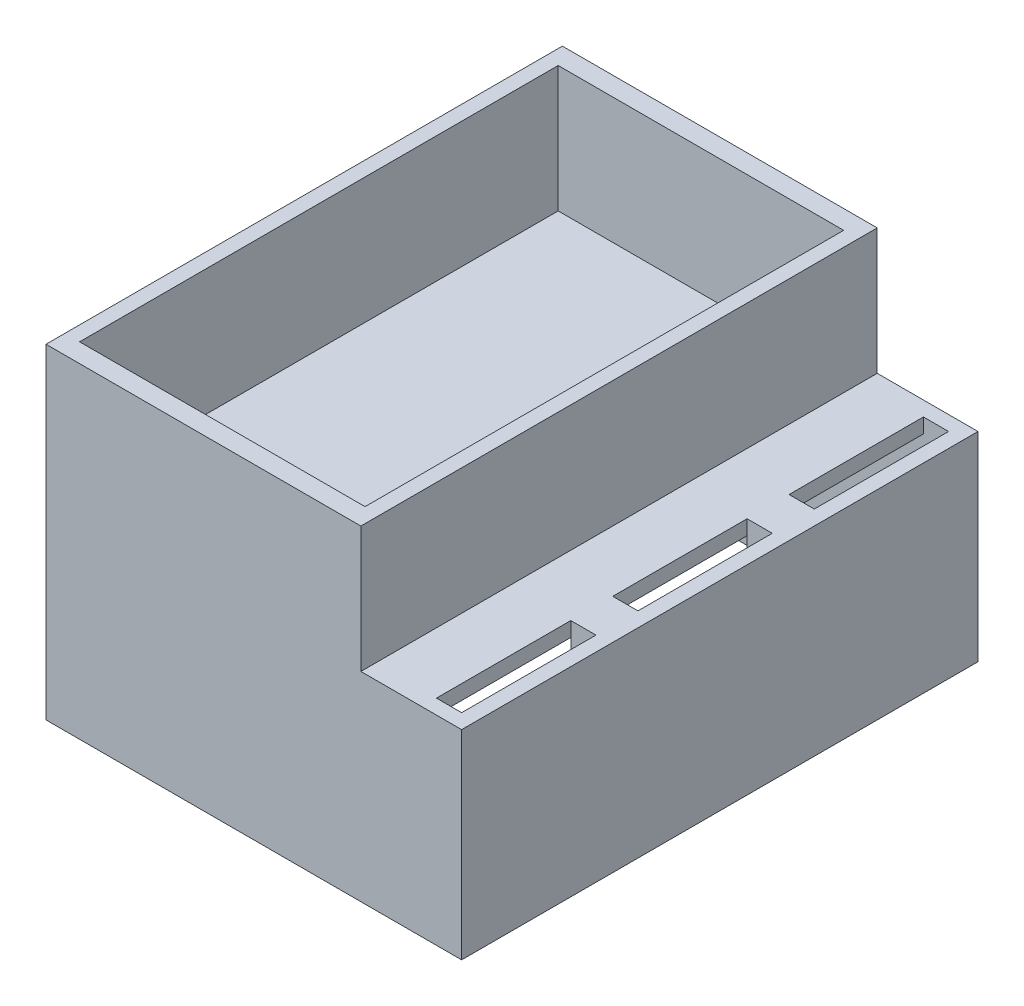
ISO-10303-21;
HEADER;
FILE_DESCRIPTION(('STEP AP214'),'2;1');
FILE_NAME('part.step','',(''),(''),'','','');
FILE_SCHEMA(('AUTOMOTIVE_DESIGN { 1 0 10303 214 1 1 1 1 }'));
ENDSEC;
DATA;
#1=APPLICATION_CONTEXT('core data for automotive mechanical design processes');
#2=APPLICATION_PROTOCOL_DEFINITION('international standard','automotive_design',2000,#1);
#3=PRODUCT_CONTEXT('',#1,'mechanical');
#4=PRODUCT('Part','Part','',(#3));
#5=PRODUCT_RELATED_PRODUCT_CATEGORY('part','',(#4));
#6=PRODUCT_DEFINITION_FORMATION('','',#4);
#7=PRODUCT_DEFINITION_CONTEXT('part definition',#1,'design');
#8=PRODUCT_DEFINITION('design','',#6,#7);
#9=PRODUCT_DEFINITION_SHAPE('','',#8);
#10=(LENGTH_UNIT() NAMED_UNIT(*) SI_UNIT(.MILLI.,.METRE.));
#11=(NAMED_UNIT(*) PLANE_ANGLE_UNIT() SI_UNIT($,.RADIAN.));
#12=(NAMED_UNIT(*) SI_UNIT($,.STERADIAN.) SOLID_ANGLE_UNIT());
#13=UNCERTAINTY_MEASURE_WITH_UNIT(LENGTH_MEASURE(1.E-05),#10,'distance_accuracy_value','');
#14=(GEOMETRIC_REPRESENTATION_CONTEXT(3) GLOBAL_UNCERTAINTY_ASSIGNED_CONTEXT((#13)) GLOBAL_UNIT_ASSIGNED_CONTEXT((#10,
#11,#12)) REPRESENTATION_CONTEXT('',''));
#15=CARTESIAN_POINT('',(0.,0.,0.));
#16=DIRECTION('',(0.,0.,1.));
#17=DIRECTION('',(1.,0.,0.));
#18=AXIS2_PLACEMENT_3D('',#15,#16,#17);
#19=CARTESIAN_POINT('',(0.,23.75,0.));
#20=DIRECTION('',(0.,-1.,0.));
#21=DIRECTION('',(0.,0.,-1.));
#22=AXIS2_PLACEMENT_3D('',#19,#20,#21);
#23=PLANE('',#22);
#24=DIRECTION('',(-1.,0.,0.));
#25=VECTOR('',#24,1.);
#26=CARTESIAN_POINT('',(0.,23.75,58.3912007269676));
#27=LINE('',#26,#25);
#28=CARTESIAN_POINT('',(-90.4120249125021,23.75,58.3912007269676));
#29=VERTEX_POINT('',#28);
#30=CARTESIAN_POINT('',(-93.4120249125021,23.75,58.3912007269676));
#31=VERTEX_POINT('',#30);
#32=EDGE_CURVE('E298',#29,#31,#27,.T.);
#33=ORIENTED_EDGE('',*,*,#32,.F.);
#34=DIRECTION('',(0.,0.,1.));
#35=VECTOR('',#34,1.);
#36=CARTESIAN_POINT('',(-90.4120249125021,23.75,0.));
#37=LINE('',#36,#35);
#38=CARTESIAN_POINT('',(-90.4120249125021,23.75,74.3912007269676));
#39=VERTEX_POINT('',#38);
#40=EDGE_CURVE('E300',#29,#39,#37,.T.);
#41=ORIENTED_EDGE('',*,*,#40,.T.);
#42=DIRECTION('',(-1.,0.,0.));
#43=VECTOR('',#42,1.);
#44=CARTESIAN_POINT('',(0.,23.75,74.3912007269676));
#45=LINE('',#44,#43);
#46=CARTESIAN_POINT('',(-93.4120249125021,23.75,74.3912007269676));
#47=VERTEX_POINT('',#46);
#48=EDGE_CURVE('E304',#39,#47,#45,.T.);
#49=ORIENTED_EDGE('',*,*,#48,.T.);
#50=DIRECTION('',(0.,0.,-1.));
#51=VECTOR('',#50,1.);
#52=CARTESIAN_POINT('',(-93.4120249125021,23.75,0.));
#53=LINE('',#52,#51);
#54=EDGE_CURVE('E307',#47,#31,#53,.T.);
#55=ORIENTED_EDGE('',*,*,#54,.T.);
#56=EDGE_LOOP('',(#33,#41,#49,#55));
#57=FACE_BOUND('',#56,.T.);
#58=DIRECTION('',(1.,0.,0.));
#59=VECTOR('',#58,1.);
#60=CARTESIAN_POINT('',(0.,23.75,16.3912007269676));
#61=LINE('',#60,#59);
#62=CARTESIAN_POINT('',(-93.4120249125021,23.75,16.3912007269676));
#63=VERTEX_POINT('',#62);
#64=CARTESIAN_POINT('',(-90.4120249125021,23.75,16.3912007269676));
#65=VERTEX_POINT('',#64);
#66=EDGE_CURVE('E330',#63,#65,#61,.T.);
#67=ORIENTED_EDGE('',*,*,#66,.T.);
#68=DIRECTION('',(0.,0.,1.));
#69=VECTOR('',#68,1.);
#70=CARTESIAN_POINT('',(-90.4120249125021,23.75,0.));
#71=LINE('',#70,#69);
#72=CARTESIAN_POINT('',(-90.4120249125021,23.75,32.3912007269676));
#73=VERTEX_POINT('',#72);
#74=EDGE_CURVE('E320',#65,#73,#71,.T.);
#75=ORIENTED_EDGE('',*,*,#74,.T.);
#76=DIRECTION('',(-1.,0.,0.));
#77=VECTOR('',#76,1.);
#78=CARTESIAN_POINT('',(0.,23.75,32.3912007269676));
#79=LINE('',#78,#77);
#80=CARTESIAN_POINT('',(-93.4120249125021,23.75,32.3912007269676));
#81=VERTEX_POINT('',#80);
#82=EDGE_CURVE('E323',#73,#81,#79,.T.);
#83=ORIENTED_EDGE('',*,*,#82,.T.);
#84=DIRECTION('',(0.,0.,-1.));
#85=VECTOR('',#84,1.);
#86=CARTESIAN_POINT('',(-93.4120249125021,23.75,0.));
#87=LINE('',#86,#85);
#88=EDGE_CURVE('E327',#81,#63,#87,.T.);
#89=ORIENTED_EDGE('',*,*,#88,.T.);
#90=EDGE_LOOP('',(#67,#75,#83,#89));
#91=FACE_BOUND('',#90,.T.);
#92=DIRECTION('',(-1.,0.,0.));
#93=VECTOR('',#92,1.);
#94=CARTESIAN_POINT('',(0.,23.75,37.3912007269676));
#95=LINE('',#94,#93);
#96=CARTESIAN_POINT('',(-90.4120249125021,23.75,37.3912007269676));
#97=VERTEX_POINT('',#96);
#98=CARTESIAN_POINT('',(-93.4120249125021,23.75,37.3912007269676));
#99=VERTEX_POINT('',#98);
#100=EDGE_CURVE('E342',#97,#99,#95,.T.);
#101=ORIENTED_EDGE('',*,*,#100,.F.);
#102=DIRECTION('',(0.,0.,1.));
#103=VECTOR('',#102,1.);
#104=CARTESIAN_POINT('',(-90.4120249125021,23.75,0.));
#105=LINE('',#104,#103);
#106=CARTESIAN_POINT('',(-90.4120249125021,23.75,53.3912007269676));
#107=VERTEX_POINT('',#106);
#108=EDGE_CURVE('E344',#97,#107,#105,.T.);
#109=ORIENTED_EDGE('',*,*,#108,.T.);
#110=DIRECTION('',(-1.,0.,0.));
#111=VECTOR('',#110,1.);
#112=CARTESIAN_POINT('',(0.,23.75,53.3912007269676));
#113=LINE('',#112,#111);
#114=CARTESIAN_POINT('',(-93.4120249125021,23.75,53.3912007269676));
#115=VERTEX_POINT('',#114);
#116=EDGE_CURVE('E347',#107,#115,#113,.T.);
#117=ORIENTED_EDGE('',*,*,#116,.T.);
#118=DIRECTION('',(0.,0.,-1.));
#119=VECTOR('',#118,1.);
#120=CARTESIAN_POINT('',(-93.4120249125021,23.75,0.));
#121=LINE('',#120,#119);
#122=EDGE_CURVE('E350',#115,#99,#121,.T.);
#123=ORIENTED_EDGE('',*,*,#122,.T.);
#124=EDGE_LOOP('',(#101,#109,#117,#123));
#125=FACE_BOUND('',#124,.T.);
#126=DIRECTION('',(0.,0.,-1.));
#127=VECTOR('',#126,1.);
#128=CARTESIAN_POINT('',(-100.662024912502,23.75,14.6412007269676));
#129=LINE('',#128,#127);
#130=CARTESIAN_POINT('',(-100.662024912502,23.75,76.1412007269676));
#131=VERTEX_POINT('',#130);
#132=CARTESIAN_POINT('',(-100.662024912502,23.75,14.6412007269676));
#133=VERTEX_POINT('',#132);
#134=EDGE_CURVE('E56',#131,#133,#129,.T.);
#135=ORIENTED_EDGE('',*,*,#134,.F.);
#136=DIRECTION('',(1.,0.,0.));
#137=VECTOR('',#136,1.);
#138=CARTESIAN_POINT('',(-138.162024912502,23.75,76.1412007269676));
#139=LINE('',#138,#137);
#140=CARTESIAN_POINT('',(-88.6620249125021,23.75,76.1412007269676));
#141=VERTEX_POINT('',#140);
#142=EDGE_CURVE('E391',#131,#141,#139,.T.);
#143=ORIENTED_EDGE('',*,*,#142,.T.);
#144=DIRECTION('',(0.,0.,-1.));
#145=VECTOR('',#144,1.);
#146=CARTESIAN_POINT('',(-88.6620249125021,23.75,76.1412007269676));
#147=LINE('',#146,#145);
#148=CARTESIAN_POINT('',(-88.6620249125021,23.75,14.6412007269676));
#149=VERTEX_POINT('',#148);
#150=EDGE_CURVE('E393',#141,#149,#147,.T.);
#151=ORIENTED_EDGE('',*,*,#150,.T.);
#152=DIRECTION('',(-1.,0.,0.));
#153=VECTOR('',#152,1.);
#154=CARTESIAN_POINT('',(-138.162024912502,23.75,14.6412007269676));
#155=LINE('',#154,#153);
#156=EDGE_CURVE('E396',#149,#133,#155,.T.);
#157=ORIENTED_EDGE('',*,*,#156,.T.);
#158=EDGE_LOOP('',(#135,#143,#151,#157));
#159=FACE_BOUND('',#158,.T.);
#160=ADVANCED_FACE('F33',(#57,#91,#125,#159),#23,.F.);
#161=CARTESIAN_POINT('',(0.,22.,0.));
#162=DIRECTION('',(0.,1.,0.));
#163=DIRECTION('',(0.,0.,1.));
#164=AXIS2_PLACEMENT_3D('',#161,#162,#163);
#165=PLANE('',#164);
#166=DIRECTION('',(0.,0.,-1.));
#167=VECTOR('',#166,1.);
#168=CARTESIAN_POINT('',(-93.4120249125021,22.,37.3912007269676));
#169=LINE('',#168,#167);
#170=CARTESIAN_POINT('',(-93.4120249125021,22.,37.3912007269676));
#171=VERTEX_POINT('',#170);
#172=CARTESIAN_POINT('',(-93.4120249125021,22.,32.3912007269676));
#173=VERTEX_POINT('',#172);
#174=EDGE_CURVE('E267',#171,#173,#169,.T.);
#175=ORIENTED_EDGE('',*,*,#174,.F.);
#176=DIRECTION('',(0.,0.,-1.));
#177=VECTOR('',#176,1.);
#178=CARTESIAN_POINT('',(-93.4120249125021,22.,0.));
#179=LINE('',#178,#177);
#180=CARTESIAN_POINT('',(-93.4120249125021,22.,53.3912007269676));
#181=VERTEX_POINT('',#180);
#182=EDGE_CURVE('E295',#181,#171,#179,.T.);
#183=ORIENTED_EDGE('',*,*,#182,.F.);
#184=DIRECTION('',(0.,0.,-1.));
#185=VECTOR('',#184,1.);
#186=CARTESIAN_POINT('',(-93.4120249125021,22.,58.3912007269676));
#187=LINE('',#186,#185);
#188=CARTESIAN_POINT('',(-93.4120249125021,22.,58.3912007269676));
#189=VERTEX_POINT('',#188);
#190=EDGE_CURVE('E269',#189,#181,#187,.T.);
#191=ORIENTED_EDGE('',*,*,#190,.F.);
#192=DIRECTION('',(0.,0.,-1.));
#193=VECTOR('',#192,1.);
#194=CARTESIAN_POINT('',(-93.4120249125021,22.,0.));
#195=LINE('',#194,#193);
#196=CARTESIAN_POINT('',(-93.4120249125021,22.,74.3912007269676));
#197=VERTEX_POINT('',#196);
#198=EDGE_CURVE('E301',#197,#189,#195,.T.);
#199=ORIENTED_EDGE('',*,*,#198,.F.);
#200=DIRECTION('',(-1.,0.,0.));
#201=VECTOR('',#200,1.);
#202=CARTESIAN_POINT('',(-90.4120249125021,22.,74.3912007269676));
#203=LINE('',#202,#201);
#204=CARTESIAN_POINT('',(-136.412024912502,22.,74.3912007269676));
#205=VERTEX_POINT('',#204);
#206=EDGE_CURVE('E363',#197,#205,#203,.T.);
#207=ORIENTED_EDGE('',*,*,#206,.T.);
#208=DIRECTION('',(0.,0.,-1.));
#209=VECTOR('',#208,1.);
#210=CARTESIAN_POINT('',(-136.412024912502,22.,74.3912007269676));
#211=LINE('',#210,#209);
#212=CARTESIAN_POINT('',(-136.412024912502,22.,16.3912007269676));
#213=VERTEX_POINT('',#212);
#214=EDGE_CURVE('E365',#205,#213,#211,.T.);
#215=ORIENTED_EDGE('',*,*,#214,.T.);
#216=DIRECTION('',(1.,0.,0.));
#217=VECTOR('',#216,1.);
#218=CARTESIAN_POINT('',(-90.4120249125021,22.,16.3912007269676));
#219=LINE('',#218,#217);
#220=CARTESIAN_POINT('',(-93.4120249125021,22.,16.3912007269676));
#221=VERTEX_POINT('',#220);
#222=EDGE_CURVE('E369',#213,#221,#219,.T.);
#223=ORIENTED_EDGE('',*,*,#222,.T.);
#224=DIRECTION('',(0.,0.,-1.));
#225=VECTOR('',#224,1.);
#226=CARTESIAN_POINT('',(-93.4120249125021,22.,0.));
#227=LINE('',#226,#225);
#228=EDGE_CURVE('E324',#173,#221,#227,.T.);
#229=ORIENTED_EDGE('',*,*,#228,.F.);
#230=EDGE_LOOP('',(#175,#183,#191,#199,#207,#215,#223,#229));
#231=FACE_BOUND('',#230,.T.);
#232=ADVANCED_FACE('F438',(#231),#165,.F.);
#233=CARTESIAN_POINT('',(-138.162024912502,23.75,76.1412007269676));
#234=DIRECTION('',(1.,0.,0.));
#235=DIRECTION('',(0.,0.,-1.));
#236=AXIS2_PLACEMENT_3D('',#233,#234,#235);
#237=PLANE('',#236);
#238=DIRECTION('',(0.,0.,1.));
#239=VECTOR('',#238,1.);
#240=CARTESIAN_POINT('',(-138.162024912502,0.,76.1412007269676));
#241=LINE('',#240,#239);
#242=CARTESIAN_POINT('',(-138.162024912502,0.,14.6412007269676));
#243=VERTEX_POINT('',#242);
#244=CARTESIAN_POINT('',(-138.162024912502,0.,76.1412007269676));
#245=VERTEX_POINT('',#244);
#246=EDGE_CURVE('E384',#243,#245,#241,.T.);
#247=ORIENTED_EDGE('',*,*,#246,.T.);
#248=DIRECTION('',(0.,-1.,0.));
#249=VECTOR('',#248,1.);
#250=CARTESIAN_POINT('',(-138.162024912502,23.75,76.1412007269676));
#251=LINE('',#250,#249);
#252=CARTESIAN_POINT('',(-138.162024912502,38.75,76.1412007269676));
#253=VERTEX_POINT('',#252);
#254=EDGE_CURVE('E11',#253,#245,#251,.T.);
#255=ORIENTED_EDGE('',*,*,#254,.F.);
#256=DIRECTION('',(0.,0.,1.));
#257=VECTOR('',#256,1.);
#258=CARTESIAN_POINT('',(-138.162024912502,38.75,14.6412007269676));
#259=LINE('',#258,#257);
#260=CARTESIAN_POINT('',(-138.162024912502,38.75,14.6412007269676));
#261=VERTEX_POINT('',#260);
#262=EDGE_CURVE('E244',#261,#253,#259,.T.);
#263=ORIENTED_EDGE('',*,*,#262,.F.);
#264=DIRECTION('',(0.,-1.,0.));
#265=VECTOR('',#264,1.);
#266=CARTESIAN_POINT('',(-138.162024912502,23.75,14.6412007269676));
#267=LINE('',#266,#265);
#268=EDGE_CURVE('E398',#261,#243,#267,.T.);
#269=ORIENTED_EDGE('',*,*,#268,.T.);
#270=EDGE_LOOP('',(#247,#255,#263,#269));
#271=FACE_BOUND('',#270,.T.);
#272=ADVANCED_FACE('F35',(#271),#237,.F.);
#273=CARTESIAN_POINT('',(-138.162024912502,23.75,76.1412007269676));
#274=DIRECTION('',(0.,0.,-1.));
#275=DIRECTION('',(-1.,0.,0.));
#276=AXIS2_PLACEMENT_3D('',#273,#274,#275);
#277=PLANE('',#276);
#278=DIRECTION('',(1.,0.,0.));
#279=VECTOR('',#278,1.);
#280=CARTESIAN_POINT('',(-138.162024912502,0.,76.1412007269676));
#281=LINE('',#280,#279);
#282=CARTESIAN_POINT('',(-88.6620249125021,0.,76.1412007269676));
#283=VERTEX_POINT('',#282);
#284=EDGE_CURVE('E401',#245,#283,#281,.T.);
#285=ORIENTED_EDGE('',*,*,#284,.T.);
#286=DIRECTION('',(0.,-1.,0.));
#287=VECTOR('',#286,1.);
#288=CARTESIAN_POINT('',(-88.6620249125021,23.75,76.1412007269676));
#289=LINE('',#288,#287);
#290=EDGE_CURVE('E41',#141,#283,#289,.T.);
#291=ORIENTED_EDGE('',*,*,#290,.F.);
#292=ORIENTED_EDGE('',*,*,#142,.F.);
#293=DIRECTION('',(0.,-1.,0.));
#294=VECTOR('',#293,1.);
#295=CARTESIAN_POINT('',(-100.662024912502,38.75,76.1412007269676));
#296=LINE('',#295,#294);
#297=CARTESIAN_POINT('',(-100.662024912502,38.75,76.1412007269676));
#298=VERTEX_POINT('',#297);
#299=EDGE_CURVE('E258',#298,#131,#296,.T.);
#300=ORIENTED_EDGE('',*,*,#299,.F.);
#301=DIRECTION('',(1.,0.,0.));
#302=VECTOR('',#301,1.);
#303=CARTESIAN_POINT('',(-138.162024912502,38.75,76.1412007269676));
#304=LINE('',#303,#302);
#305=EDGE_CURVE('E247',#253,#298,#304,.T.);
#306=ORIENTED_EDGE('',*,*,#305,.F.);
#307=ORIENTED_EDGE('',*,*,#254,.T.);
#308=EDGE_LOOP('',(#285,#291,#292,#300,#306,#307));
#309=FACE_BOUND('',#308,.T.);
#310=ADVANCED_FACE('F436',(#309),#277,.F.);
#311=CARTESIAN_POINT('',(-88.6620249125021,23.75,76.1412007269676));
#312=DIRECTION('',(-1.,0.,0.));
#313=DIRECTION('',(0.,0.,1.));
#314=AXIS2_PLACEMENT_3D('',#311,#312,#313);
#315=PLANE('',#314);
#316=DIRECTION('',(0.,0.,-1.));
#317=VECTOR('',#316,1.);
#318=CARTESIAN_POINT('',(-88.6620249125021,0.,76.1412007269676));
#319=LINE('',#318,#317);
#320=CARTESIAN_POINT('',(-88.6620249125021,0.,14.6412007269676));
#321=VERTEX_POINT('',#320);
#322=EDGE_CURVE('E403',#283,#321,#319,.T.);
#323=ORIENTED_EDGE('',*,*,#322,.T.);
#324=DIRECTION('',(0.,-1.,0.));
#325=VECTOR('',#324,1.);
#326=CARTESIAN_POINT('',(-88.6620249125021,23.75,14.6412007269676));
#327=LINE('',#326,#325);
#328=EDGE_CURVE('E408',#149,#321,#327,.T.);
#329=ORIENTED_EDGE('',*,*,#328,.F.);
#330=ORIENTED_EDGE('',*,*,#150,.F.);
#331=ORIENTED_EDGE('',*,*,#290,.T.);
#332=EDGE_LOOP('',(#323,#329,#330,#331));
#333=FACE_BOUND('',#332,.T.);
#334=ADVANCED_FACE('F415',(#333),#315,.F.);
#335=CARTESIAN_POINT('',(-138.162024912502,23.75,14.6412007269676));
#336=DIRECTION('',(0.,0.,1.));
#337=DIRECTION('',(1.,0.,0.));
#338=AXIS2_PLACEMENT_3D('',#335,#336,#337);
#339=PLANE('',#338);
#340=DIRECTION('',(-1.,0.,0.));
#341=VECTOR('',#340,1.);
#342=CARTESIAN_POINT('',(-138.162024912502,0.,14.6412007269676));
#343=LINE('',#342,#341);
#344=EDGE_CURVE('E394',#321,#243,#343,.T.);
#345=ORIENTED_EDGE('',*,*,#344,.T.);
#346=ORIENTED_EDGE('',*,*,#268,.F.);
#347=DIRECTION('',(-1.,0.,0.));
#348=VECTOR('',#347,1.);
#349=CARTESIAN_POINT('',(-138.162024912502,38.75,14.6412007269676));
#350=LINE('',#349,#348);
#351=CARTESIAN_POINT('',(-100.662024912502,38.75,14.6412007269676));
#352=VERTEX_POINT('',#351);
#353=EDGE_CURVE('E251',#352,#261,#350,.T.);
#354=ORIENTED_EDGE('',*,*,#353,.F.);
#355=DIRECTION('',(0.,-1.,0.));
#356=VECTOR('',#355,1.);
#357=CARTESIAN_POINT('',(-100.662024912502,38.75,14.6412007269676));
#358=LINE('',#357,#356);
#359=EDGE_CURVE('E254',#352,#133,#358,.T.);
#360=ORIENTED_EDGE('',*,*,#359,.T.);
#361=ORIENTED_EDGE('',*,*,#156,.F.);
#362=ORIENTED_EDGE('',*,*,#328,.T.);
#363=EDGE_LOOP('',(#345,#346,#354,#360,#361,#362));
#364=FACE_BOUND('',#363,.T.);
#365=ADVANCED_FACE('F423',(#364),#339,.F.);
#366=CARTESIAN_POINT('',(0.,0.,0.));
#367=DIRECTION('',(0.,-1.,0.));
#368=DIRECTION('',(0.,0.,-1.));
#369=AXIS2_PLACEMENT_3D('',#366,#367,#368);
#370=PLANE('',#369);
#371=DIRECTION('',(0.,0.,1.));
#372=VECTOR('',#371,1.);
#373=CARTESIAN_POINT('',(-90.4120249125021,0.,74.3912007269676));
#374=LINE('',#373,#372);
#375=CARTESIAN_POINT('',(-90.4120249125021,0.,16.3912007269676));
#376=VERTEX_POINT('',#375);
#377=CARTESIAN_POINT('',(-90.4120249125021,0.,74.3912007269676));
#378=VERTEX_POINT('',#377);
#379=EDGE_CURVE('E316',#376,#378,#374,.T.);
#380=ORIENTED_EDGE('',*,*,#379,.F.);
#381=DIRECTION('',(1.,0.,0.));
#382=VECTOR('',#381,1.);
#383=CARTESIAN_POINT('',(-90.4120249125021,0.,16.3912007269676));
#384=LINE('',#383,#382);
#385=CARTESIAN_POINT('',(-136.412024912502,0.,16.3912007269676));
#386=VERTEX_POINT('',#385);
#387=EDGE_CURVE('E366',#386,#376,#384,.T.);
#388=ORIENTED_EDGE('',*,*,#387,.F.);
#389=DIRECTION('',(0.,0.,-1.));
#390=VECTOR('',#389,1.);
#391=CARTESIAN_POINT('',(-136.412024912502,0.,74.3912007269676));
#392=LINE('',#391,#390);
#393=CARTESIAN_POINT('',(-136.412024912502,0.,74.3912007269676));
#394=VERTEX_POINT('',#393);
#395=EDGE_CURVE('E377',#394,#386,#392,.T.);
#396=ORIENTED_EDGE('',*,*,#395,.F.);
#397=DIRECTION('',(-1.,0.,0.));
#398=VECTOR('',#397,1.);
#399=CARTESIAN_POINT('',(-90.4120249125021,0.,74.3912007269676));
#400=LINE('',#399,#398);
#401=EDGE_CURVE('E374',#378,#394,#400,.T.);
#402=ORIENTED_EDGE('',*,*,#401,.F.);
#403=EDGE_LOOP('',(#380,#388,#396,#402));
#404=FACE_BOUND('',#403,.T.);
#405=ORIENTED_EDGE('',*,*,#246,.F.);
#406=ORIENTED_EDGE('',*,*,#344,.F.);
#407=ORIENTED_EDGE('',*,*,#322,.F.);
#408=ORIENTED_EDGE('',*,*,#284,.F.);
#409=EDGE_LOOP('',(#405,#406,#407,#408));
#410=FACE_BOUND('',#409,.T.);
#411=ADVANCED_FACE('F421',(#404,#410),#370,.T.);
#412=CARTESIAN_POINT('',(-90.4120249125021,22.,74.3912007269676));
#413=DIRECTION('',(1.,0.,0.));
#414=DIRECTION('',(0.,0.,-1.));
#415=AXIS2_PLACEMENT_3D('',#412,#413,#414);
#416=PLANE('',#415);
#417=DIRECTION('',(0.,0.,-1.));
#418=VECTOR('',#417,1.);
#419=CARTESIAN_POINT('',(-90.4120249125021,18.,37.3912007269676));
#420=LINE('',#419,#418);
#421=CARTESIAN_POINT('',(-90.4120249125021,18.,37.3912007269676));
#422=VERTEX_POINT('',#421);
#423=CARTESIAN_POINT('',(-90.4120249125021,18.,32.3912007269676));
#424=VERTEX_POINT('',#423);
#425=EDGE_CURVE('E265',#422,#424,#420,.T.);
#426=ORIENTED_EDGE('',*,*,#425,.T.);
#427=DIRECTION('',(0.,-1.,0.));
#428=VECTOR('',#427,1.);
#429=CARTESIAN_POINT('',(-90.4120249125021,23.75,32.3912007269676));
#430=LINE('',#429,#428);
#431=EDGE_CURVE('E333',#73,#424,#430,.T.);
#432=ORIENTED_EDGE('',*,*,#431,.F.);
#433=ORIENTED_EDGE('',*,*,#74,.F.);
#434=DIRECTION('',(0.,-1.,0.));
#435=VECTOR('',#434,1.);
#436=CARTESIAN_POINT('',(-90.4120249125021,22.,16.3912007269676));
#437=LINE('',#436,#435);
#438=EDGE_CURVE('E382',#65,#376,#437,.T.);
#439=ORIENTED_EDGE('',*,*,#438,.T.);
#440=ORIENTED_EDGE('',*,*,#379,.T.);
#441=DIRECTION('',(0.,-1.,0.));
#442=VECTOR('',#441,1.);
#443=CARTESIAN_POINT('',(-90.4120249125021,22.,74.3912007269676));
#444=LINE('',#443,#442);
#445=EDGE_CURVE('E372',#39,#378,#444,.T.);
#446=ORIENTED_EDGE('',*,*,#445,.F.);
#447=ORIENTED_EDGE('',*,*,#40,.F.);
#448=DIRECTION('',(0.,-1.,0.));
#449=VECTOR('',#448,1.);
#450=CARTESIAN_POINT('',(-90.4120249125021,23.75,58.3912007269676));
#451=LINE('',#450,#449);
#452=CARTESIAN_POINT('',(-90.4120249125021,18.,58.3912007269676));
#453=VERTEX_POINT('',#452);
#454=EDGE_CURVE('E310',#29,#453,#451,.T.);
#455=ORIENTED_EDGE('',*,*,#454,.T.);
#456=DIRECTION('',(0.,0.,-1.));
#457=VECTOR('',#456,1.);
#458=CARTESIAN_POINT('',(-90.4120249125021,18.,58.3912007269676));
#459=LINE('',#458,#457);
#460=CARTESIAN_POINT('',(-90.4120249125021,18.,53.3912007269676));
#461=VERTEX_POINT('',#460);
#462=EDGE_CURVE('E286',#453,#461,#459,.T.);
#463=ORIENTED_EDGE('',*,*,#462,.T.);
#464=DIRECTION('',(0.,-1.,0.));
#465=VECTOR('',#464,1.);
#466=CARTESIAN_POINT('',(-90.4120249125021,23.75,53.3912007269676));
#467=LINE('',#466,#465);
#468=EDGE_CURVE('E360',#107,#461,#467,.T.);
#469=ORIENTED_EDGE('',*,*,#468,.F.);
#470=ORIENTED_EDGE('',*,*,#108,.F.);
#471=DIRECTION('',(0.,-1.,0.));
#472=VECTOR('',#471,1.);
#473=CARTESIAN_POINT('',(-90.4120249125021,23.75,37.3912007269676));
#474=LINE('',#473,#472);
#475=EDGE_CURVE('E353',#97,#422,#474,.T.);
#476=ORIENTED_EDGE('',*,*,#475,.T.);
#477=EDGE_LOOP('',(#426,#432,#433,#439,#440,#446,#447,#455,#463,#469,#470,#476));
#478=FACE_BOUND('',#477,.T.);
#479=ADVANCED_FACE('F450',(#478),#416,.F.);
#480=CARTESIAN_POINT('',(-90.4120249125021,22.,16.3912007269676));
#481=DIRECTION('',(0.,0.,-1.));
#482=DIRECTION('',(-1.,0.,0.));
#483=AXIS2_PLACEMENT_3D('',#480,#481,#482);
#484=PLANE('',#483);
#485=ORIENTED_EDGE('',*,*,#387,.T.);
#486=ORIENTED_EDGE('',*,*,#438,.F.);
#487=ORIENTED_EDGE('',*,*,#66,.F.);
#488=DIRECTION('',(0.,-1.,0.));
#489=VECTOR('',#488,1.);
#490=CARTESIAN_POINT('',(-93.4120249125021,23.75,16.3912007269676));
#491=LINE('',#490,#489);
#492=EDGE_CURVE('E312',#63,#221,#491,.T.);
#493=ORIENTED_EDGE('',*,*,#492,.T.);
#494=ORIENTED_EDGE('',*,*,#222,.F.);
#495=DIRECTION('',(0.,-1.,0.));
#496=VECTOR('',#495,1.);
#497=CARTESIAN_POINT('',(-136.412024912502,22.,16.3912007269676));
#498=LINE('',#497,#496);
#499=EDGE_CURVE('E385',#213,#386,#498,.T.);
#500=ORIENTED_EDGE('',*,*,#499,.T.);
#501=EDGE_LOOP('',(#485,#486,#487,#493,#494,#500));
#502=FACE_BOUND('',#501,.T.);
#503=ADVANCED_FACE('F484',(#502),#484,.F.);
#504=CARTESIAN_POINT('',(-136.412024912502,22.,74.3912007269676));
#505=DIRECTION('',(-1.,0.,0.));
#506=DIRECTION('',(0.,0.,1.));
#507=AXIS2_PLACEMENT_3D('',#504,#505,#506);
#508=PLANE('',#507);
#509=ORIENTED_EDGE('',*,*,#395,.T.);
#510=ORIENTED_EDGE('',*,*,#499,.F.);
#511=ORIENTED_EDGE('',*,*,#214,.F.);
#512=DIRECTION('',(0.,-1.,0.));
#513=VECTOR('',#512,1.);
#514=CARTESIAN_POINT('',(-136.412024912502,22.,74.3912007269676));
#515=LINE('',#514,#513);
#516=EDGE_CURVE('E387',#205,#394,#515,.T.);
#517=ORIENTED_EDGE('',*,*,#516,.T.);
#518=EDGE_LOOP('',(#509,#510,#511,#517));
#519=FACE_BOUND('',#518,.T.);
#520=ADVANCED_FACE('F687',(#519),#508,.F.);
#521=CARTESIAN_POINT('',(-90.4120249125021,22.,74.3912007269676));
#522=DIRECTION('',(0.,0.,1.));
#523=DIRECTION('',(1.,0.,0.));
#524=AXIS2_PLACEMENT_3D('',#521,#522,#523);
#525=PLANE('',#524);
#526=ORIENTED_EDGE('',*,*,#401,.T.);
#527=ORIENTED_EDGE('',*,*,#516,.F.);
#528=ORIENTED_EDGE('',*,*,#206,.F.);
#529=DIRECTION('',(0.,-1.,0.));
#530=VECTOR('',#529,1.);
#531=CARTESIAN_POINT('',(-93.4120249125021,23.75,74.3912007269676));
#532=LINE('',#531,#530);
#533=EDGE_CURVE('E317',#47,#197,#532,.T.);
#534=ORIENTED_EDGE('',*,*,#533,.F.);
#535=ORIENTED_EDGE('',*,*,#48,.F.);
#536=ORIENTED_EDGE('',*,*,#445,.T.);
#537=EDGE_LOOP('',(#526,#527,#528,#534,#535,#536));
#538=FACE_BOUND('',#537,.T.);
#539=ADVANCED_FACE('F497',(#538),#525,.F.);
#540=CARTESIAN_POINT('',(0.,23.75,37.3912007269676));
#541=DIRECTION('',(0.,0.,1.));
#542=DIRECTION('',(1.,0.,0.));
#543=AXIS2_PLACEMENT_3D('',#540,#541,#542);
#544=PLANE('',#543);
#545=DIRECTION('',(0.,-1.,0.));
#546=VECTOR('',#545,1.);
#547=CARTESIAN_POINT('',(-93.4120249125021,23.75,37.3912007269676));
#548=LINE('',#547,#546);
#549=EDGE_CURVE('E336',#99,#171,#548,.T.);
#550=ORIENTED_EDGE('',*,*,#549,.T.);
#551=DIRECTION('',(0.,1.,0.));
#552=VECTOR('',#551,1.);
#553=CARTESIAN_POINT('',(-93.4120249125021,18.,37.3912007269676));
#554=LINE('',#553,#552);
#555=CARTESIAN_POINT('',(-93.4120249125021,18.,37.3912007269676));
#556=VERTEX_POINT('',#555);
#557=EDGE_CURVE('E261',#556,#171,#554,.T.);
#558=ORIENTED_EDGE('',*,*,#557,.F.);
#559=DIRECTION('',(-1.,0.,0.));
#560=VECTOR('',#559,1.);
#561=CARTESIAN_POINT('',(-90.4120249125021,18.,37.3912007269676));
#562=LINE('',#561,#560);
#563=EDGE_CURVE('E273',#422,#556,#562,.T.);
#564=ORIENTED_EDGE('',*,*,#563,.F.);
#565=ORIENTED_EDGE('',*,*,#475,.F.);
#566=ORIENTED_EDGE('',*,*,#100,.T.);
#567=EDGE_LOOP('',(#550,#558,#564,#565,#566));
#568=FACE_BOUND('',#567,.T.);
#569=ADVANCED_FACE('F492',(#568),#544,.T.);
#570=CARTESIAN_POINT('',(-93.4120249125021,23.75,0.));
#571=DIRECTION('',(-1.,0.,0.));
#572=DIRECTION('',(0.,0.,1.));
#573=AXIS2_PLACEMENT_3D('',#570,#571,#572);
#574=PLANE('',#573);
#575=ORIENTED_EDGE('',*,*,#182,.T.);
#576=ORIENTED_EDGE('',*,*,#549,.F.);
#577=ORIENTED_EDGE('',*,*,#122,.F.);
#578=DIRECTION('',(0.,-1.,0.));
#579=VECTOR('',#578,1.);
#580=CARTESIAN_POINT('',(-93.4120249125021,23.75,53.3912007269676));
#581=LINE('',#580,#579);
#582=EDGE_CURVE('E358',#115,#181,#581,.T.);
#583=ORIENTED_EDGE('',*,*,#582,.T.);
#584=EDGE_LOOP('',(#575,#576,#577,#583));
#585=FACE_BOUND('',#584,.T.);
#586=ADVANCED_FACE('F496',(#585),#574,.F.);
#587=CARTESIAN_POINT('',(0.,23.75,53.3912007269676));
#588=DIRECTION('',(0.,0.,1.));
#589=DIRECTION('',(1.,0.,0.));
#590=AXIS2_PLACEMENT_3D('',#587,#588,#589);
#591=PLANE('',#590);
#592=ORIENTED_EDGE('',*,*,#468,.T.);
#593=DIRECTION('',(-1.,0.,0.));
#594=VECTOR('',#593,1.);
#595=CARTESIAN_POINT('',(-90.4120249125021,18.,53.3912007269676));
#596=LINE('',#595,#594);
#597=CARTESIAN_POINT('',(-93.4120249125021,18.,53.3912007269676));
#598=VERTEX_POINT('',#597);
#599=EDGE_CURVE('E279',#461,#598,#596,.T.);
#600=ORIENTED_EDGE('',*,*,#599,.T.);
#601=DIRECTION('',(0.,1.,0.));
#602=VECTOR('',#601,1.);
#603=CARTESIAN_POINT('',(-93.4120249125021,18.,53.3912007269676));
#604=LINE('',#603,#602);
#605=EDGE_CURVE('E289',#598,#181,#604,.T.);
#606=ORIENTED_EDGE('',*,*,#605,.T.);
#607=ORIENTED_EDGE('',*,*,#582,.F.);
#608=ORIENTED_EDGE('',*,*,#116,.F.);
#609=EDGE_LOOP('',(#592,#600,#606,#607,#608));
#610=FACE_BOUND('',#609,.T.);
#611=ADVANCED_FACE('F510',(#610),#591,.F.);
#612=CARTESIAN_POINT('',(-93.4120249125021,23.75,0.));
#613=DIRECTION('',(-1.,0.,0.));
#614=DIRECTION('',(0.,0.,1.));
#615=AXIS2_PLACEMENT_3D('',#612,#613,#614);
#616=PLANE('',#615);
#617=ORIENTED_EDGE('',*,*,#228,.T.);
#618=ORIENTED_EDGE('',*,*,#492,.F.);
#619=ORIENTED_EDGE('',*,*,#88,.F.);
#620=DIRECTION('',(0.,-1.,0.));
#621=VECTOR('',#620,1.);
#622=CARTESIAN_POINT('',(-93.4120249125021,23.75,32.3912007269676));
#623=LINE('',#622,#621);
#624=EDGE_CURVE('E338',#81,#173,#623,.T.);
#625=ORIENTED_EDGE('',*,*,#624,.T.);
#626=EDGE_LOOP('',(#617,#618,#619,#625));
#627=FACE_BOUND('',#626,.T.);
#628=ADVANCED_FACE('F520',(#627),#616,.F.);
#629=CARTESIAN_POINT('',(0.,23.75,32.3912007269676));
#630=DIRECTION('',(0.,0.,1.));
#631=DIRECTION('',(1.,0.,0.));
#632=AXIS2_PLACEMENT_3D('',#629,#630,#631);
#633=PLANE('',#632);
#634=ORIENTED_EDGE('',*,*,#431,.T.);
#635=DIRECTION('',(-1.,0.,0.));
#636=VECTOR('',#635,1.);
#637=CARTESIAN_POINT('',(-90.4120249125021,18.,32.3912007269676));
#638=LINE('',#637,#636);
#639=CARTESIAN_POINT('',(-93.4120249125021,18.,32.3912007269676));
#640=VERTEX_POINT('',#639);
#641=EDGE_CURVE('E270',#424,#640,#638,.T.);
#642=ORIENTED_EDGE('',*,*,#641,.T.);
#643=DIRECTION('',(0.,1.,0.));
#644=VECTOR('',#643,1.);
#645=CARTESIAN_POINT('',(-93.4120249125021,18.,32.3912007269676));
#646=LINE('',#645,#644);
#647=EDGE_CURVE('E262',#640,#173,#646,.T.);
#648=ORIENTED_EDGE('',*,*,#647,.T.);
#649=ORIENTED_EDGE('',*,*,#624,.F.);
#650=ORIENTED_EDGE('',*,*,#82,.F.);
#651=EDGE_LOOP('',(#634,#642,#648,#649,#650));
#652=FACE_BOUND('',#651,.T.);
#653=ADVANCED_FACE('F531',(#652),#633,.F.);
#654=CARTESIAN_POINT('',(0.,23.75,58.3912007269676));
#655=DIRECTION('',(0.,0.,1.));
#656=DIRECTION('',(1.,0.,0.));
#657=AXIS2_PLACEMENT_3D('',#654,#655,#656);
#658=PLANE('',#657);
#659=DIRECTION('',(0.,-1.,0.));
#660=VECTOR('',#659,1.);
#661=CARTESIAN_POINT('',(-93.4120249125021,23.75,58.3912007269676));
#662=LINE('',#661,#660);
#663=EDGE_CURVE('E313',#31,#189,#662,.T.);
#664=ORIENTED_EDGE('',*,*,#663,.T.);
#665=DIRECTION('',(0.,1.,0.));
#666=VECTOR('',#665,1.);
#667=CARTESIAN_POINT('',(-93.4120249125021,18.,58.3912007269676));
#668=LINE('',#667,#666);
#669=CARTESIAN_POINT('',(-93.4120249125021,18.,58.3912007269676));
#670=VERTEX_POINT('',#669);
#671=EDGE_CURVE('E292',#670,#189,#668,.T.);
#672=ORIENTED_EDGE('',*,*,#671,.F.);
#673=DIRECTION('',(-1.,0.,0.));
#674=VECTOR('',#673,1.);
#675=CARTESIAN_POINT('',(-90.4120249125021,18.,58.3912007269676));
#676=LINE('',#675,#674);
#677=EDGE_CURVE('E284',#453,#670,#676,.T.);
#678=ORIENTED_EDGE('',*,*,#677,.F.);
#679=ORIENTED_EDGE('',*,*,#454,.F.);
#680=ORIENTED_EDGE('',*,*,#32,.T.);
#681=EDGE_LOOP('',(#664,#672,#678,#679,#680));
#682=FACE_BOUND('',#681,.T.);
#683=ADVANCED_FACE('F541',(#682),#658,.T.);
#684=CARTESIAN_POINT('',(-93.4120249125021,23.75,0.));
#685=DIRECTION('',(-1.,0.,0.));
#686=DIRECTION('',(0.,0.,1.));
#687=AXIS2_PLACEMENT_3D('',#684,#685,#686);
#688=PLANE('',#687);
#689=ORIENTED_EDGE('',*,*,#198,.T.);
#690=ORIENTED_EDGE('',*,*,#663,.F.);
#691=ORIENTED_EDGE('',*,*,#54,.F.);
#692=ORIENTED_EDGE('',*,*,#533,.T.);
#693=EDGE_LOOP('',(#689,#690,#691,#692));
#694=FACE_BOUND('',#693,.T.);
#695=ADVANCED_FACE('F476',(#694),#688,.F.);
#696=CARTESIAN_POINT('',(-93.4120249125021,18.,58.3912007269676));
#697=DIRECTION('',(1.,0.,0.));
#698=DIRECTION('',(0.,0.,-1.));
#699=AXIS2_PLACEMENT_3D('',#696,#697,#698);
#700=PLANE('',#699);
#701=ORIENTED_EDGE('',*,*,#190,.T.);
#702=ORIENTED_EDGE('',*,*,#605,.F.);
#703=DIRECTION('',(0.,0.,-1.));
#704=VECTOR('',#703,1.);
#705=CARTESIAN_POINT('',(-93.4120249125021,18.,58.3912007269676));
#706=LINE('',#705,#704);
#707=EDGE_CURVE('E282',#670,#598,#706,.T.);
#708=ORIENTED_EDGE('',*,*,#707,.F.);
#709=ORIENTED_EDGE('',*,*,#671,.T.);
#710=EDGE_LOOP('',(#701,#702,#708,#709));
#711=FACE_BOUND('',#710,.T.);
#712=ADVANCED_FACE('F558',(#711),#700,.F.);
#713=CARTESIAN_POINT('',(0.,18.,0.));
#714=DIRECTION('',(0.,-1.,0.));
#715=DIRECTION('',(0.,0.,-1.));
#716=AXIS2_PLACEMENT_3D('',#713,#714,#715);
#717=PLANE('',#716);
#718=ORIENTED_EDGE('',*,*,#599,.F.);
#719=ORIENTED_EDGE('',*,*,#462,.F.);
#720=ORIENTED_EDGE('',*,*,#677,.T.);
#721=ORIENTED_EDGE('',*,*,#707,.T.);
#722=EDGE_LOOP('',(#718,#719,#720,#721));
#723=FACE_BOUND('',#722,.T.);
#724=ADVANCED_FACE('F562',(#723),#717,.T.);
#725=CARTESIAN_POINT('',(-93.4120249125021,18.,37.3912007269676));
#726=DIRECTION('',(1.,0.,0.));
#727=DIRECTION('',(0.,0.,-1.));
#728=AXIS2_PLACEMENT_3D('',#725,#726,#727);
#729=PLANE('',#728);
#730=ORIENTED_EDGE('',*,*,#174,.T.);
#731=ORIENTED_EDGE('',*,*,#647,.F.);
#732=DIRECTION('',(0.,0.,-1.));
#733=VECTOR('',#732,1.);
#734=CARTESIAN_POINT('',(-93.4120249125021,18.,37.3912007269676));
#735=LINE('',#734,#733);
#736=EDGE_CURVE('E275',#556,#640,#735,.T.);
#737=ORIENTED_EDGE('',*,*,#736,.F.);
#738=ORIENTED_EDGE('',*,*,#557,.T.);
#739=EDGE_LOOP('',(#730,#731,#737,#738));
#740=FACE_BOUND('',#739,.T.);
#741=ADVANCED_FACE('F572',(#740),#729,.F.);
#742=CARTESIAN_POINT('',(0.,18.,0.));
#743=DIRECTION('',(0.,-1.,0.));
#744=DIRECTION('',(0.,0.,-1.));
#745=AXIS2_PLACEMENT_3D('',#742,#743,#744);
#746=PLANE('',#745);
#747=ORIENTED_EDGE('',*,*,#641,.F.);
#748=ORIENTED_EDGE('',*,*,#425,.F.);
#749=ORIENTED_EDGE('',*,*,#563,.T.);
#750=ORIENTED_EDGE('',*,*,#736,.T.);
#751=EDGE_LOOP('',(#747,#748,#749,#750));
#752=FACE_BOUND('',#751,.T.);
#753=ADVANCED_FACE('F582',(#752),#746,.T.);
#754=CARTESIAN_POINT('',(-100.662024912502,38.75,14.6412007269676));
#755=DIRECTION('',(-1.,0.,0.));
#756=DIRECTION('',(0.,0.,1.));
#757=AXIS2_PLACEMENT_3D('',#754,#755,#756);
#758=PLANE('',#757);
#759=ORIENTED_EDGE('',*,*,#134,.T.);
#760=ORIENTED_EDGE('',*,*,#359,.F.);
#761=DIRECTION('',(0.,0.,-1.));
#762=VECTOR('',#761,1.);
#763=CARTESIAN_POINT('',(-100.662024912502,38.75,14.6412007269676));
#764=LINE('',#763,#762);
#765=EDGE_CURVE('E249',#298,#352,#764,.T.);
#766=ORIENTED_EDGE('',*,*,#765,.F.);
#767=ORIENTED_EDGE('',*,*,#299,.T.);
#768=EDGE_LOOP('',(#759,#760,#766,#767));
#769=FACE_BOUND('',#768,.T.);
#770=ADVANCED_FACE('F435',(#769),#758,.F.);
#771=CARTESIAN_POINT('',(0.,38.75,0.));
#772=DIRECTION('',(0.,1.,0.));
#773=DIRECTION('',(0.,0.,1.));
#774=AXIS2_PLACEMENT_3D('',#771,#772,#773);
#775=PLANE('',#774);
#776=DIRECTION('',(0.,0.,1.));
#777=VECTOR('',#776,1.);
#778=CARTESIAN_POINT('',(-136.412024912502,38.75,16.8912007269676));
#779=LINE('',#778,#777);
#780=CARTESIAN_POINT('',(-136.412024912502,38.75,16.8912007269676));
#781=VERTEX_POINT('',#780);
#782=CARTESIAN_POINT('',(-136.412024912502,38.75,73.8912007269676));
#783=VERTEX_POINT('',#782);
#784=EDGE_CURVE('E48',#781,#783,#779,.T.);
#785=ORIENTED_EDGE('',*,*,#784,.F.);
#786=DIRECTION('',(-1.,0.,0.));
#787=VECTOR('',#786,1.);
#788=CARTESIAN_POINT('',(-136.412024912502,38.75,16.8912007269676));
#789=LINE('',#788,#787);
#790=CARTESIAN_POINT('',(-102.412024912502,38.75,16.8912007269676));
#791=VERTEX_POINT('',#790);
#792=EDGE_CURVE('E226',#791,#781,#789,.T.);
#793=ORIENTED_EDGE('',*,*,#792,.F.);
#794=DIRECTION('',(0.,0.,-1.));
#795=VECTOR('',#794,1.);
#796=CARTESIAN_POINT('',(-102.412024912502,38.75,16.8912007269676));
#797=LINE('',#796,#795);
#798=CARTESIAN_POINT('',(-102.412024912502,38.75,73.8912007269676));
#799=VERTEX_POINT('',#798);
#800=EDGE_CURVE('E229',#799,#791,#797,.T.);
#801=ORIENTED_EDGE('',*,*,#800,.F.);
#802=DIRECTION('',(1.,0.,0.));
#803=VECTOR('',#802,1.);
#804=CARTESIAN_POINT('',(-136.412024912502,38.75,73.8912007269676));
#805=LINE('',#804,#803);
#806=EDGE_CURVE('E235',#783,#799,#805,.T.);
#807=ORIENTED_EDGE('',*,*,#806,.F.);
#808=EDGE_LOOP('',(#785,#793,#801,#807));
#809=FACE_BOUND('',#808,.T.);
#810=ORIENTED_EDGE('',*,*,#262,.T.);
#811=ORIENTED_EDGE('',*,*,#305,.T.);
#812=ORIENTED_EDGE('',*,*,#765,.T.);
#813=ORIENTED_EDGE('',*,*,#353,.T.);
#814=EDGE_LOOP('',(#810,#811,#812,#813));
#815=FACE_BOUND('',#814,.T.);
#816=ADVANCED_FACE('F430',(#809,#815),#775,.T.);
#817=CARTESIAN_POINT('',(-136.412024912502,23.75,16.8912007269676));
#818=DIRECTION('',(-1.,0.,0.));
#819=DIRECTION('',(0.,0.,1.));
#820=AXIS2_PLACEMENT_3D('',#817,#818,#819);
#821=PLANE('',#820);
#822=ORIENTED_EDGE('',*,*,#784,.T.);
#823=DIRECTION('',(0.,1.,0.));
#824=VECTOR('',#823,1.);
#825=CARTESIAN_POINT('',(-136.412024912502,23.75,73.8912007269676));
#826=LINE('',#825,#824);
#827=CARTESIAN_POINT('',(-136.412024912502,23.75,73.8912007269676));
#828=VERTEX_POINT('',#827);
#829=EDGE_CURVE('E204',#828,#783,#826,.T.);
#830=ORIENTED_EDGE('',*,*,#829,.F.);
#831=DIRECTION('',(0.,0.,1.));
#832=VECTOR('',#831,1.);
#833=CARTESIAN_POINT('',(-136.412024912502,23.75,16.8912007269676));
#834=LINE('',#833,#832);
#835=CARTESIAN_POINT('',(-136.412024912502,23.75,16.8912007269676));
#836=VERTEX_POINT('',#835);
#837=EDGE_CURVE('E208',#836,#828,#834,.T.);
#838=ORIENTED_EDGE('',*,*,#837,.F.);
#839=DIRECTION('',(0.,1.,0.));
#840=VECTOR('',#839,1.);
#841=CARTESIAN_POINT('',(-136.412024912502,23.75,16.8912007269676));
#842=LINE('',#841,#840);
#843=EDGE_CURVE('E239',#836,#781,#842,.T.);
#844=ORIENTED_EDGE('',*,*,#843,.T.);
#845=EDGE_LOOP('',(#822,#830,#838,#844));
#846=FACE_BOUND('',#845,.T.);
#847=ADVANCED_FACE('F206',(#846),#821,.F.);
#848=CARTESIAN_POINT('',(-136.412024912502,23.75,16.8912007269676));
#849=DIRECTION('',(0.,0.,-1.));
#850=DIRECTION('',(-1.,0.,0.));
#851=AXIS2_PLACEMENT_3D('',#848,#849,#850);
#852=PLANE('',#851);
#853=ORIENTED_EDGE('',*,*,#792,.T.);
#854=ORIENTED_EDGE('',*,*,#843,.F.);
#855=DIRECTION('',(-1.,0.,0.));
#856=VECTOR('',#855,1.);
#857=CARTESIAN_POINT('',(-136.412024912502,23.75,16.8912007269676));
#858=LINE('',#857,#856);
#859=CARTESIAN_POINT('',(-102.412024912502,23.75,16.8912007269676));
#860=VERTEX_POINT('',#859);
#861=EDGE_CURVE('E214',#860,#836,#858,.T.);
#862=ORIENTED_EDGE('',*,*,#861,.F.);
#863=DIRECTION('',(0.,1.,0.));
#864=VECTOR('',#863,1.);
#865=CARTESIAN_POINT('',(-102.412024912502,23.75,16.8912007269676));
#866=LINE('',#865,#864);
#867=EDGE_CURVE('E241',#860,#791,#866,.T.);
#868=ORIENTED_EDGE('',*,*,#867,.T.);
#869=EDGE_LOOP('',(#853,#854,#862,#868));
#870=FACE_BOUND('',#869,.T.);
#871=ADVANCED_FACE('F643',(#870),#852,.F.);
#872=CARTESIAN_POINT('',(-102.412024912502,23.75,16.8912007269676));
#873=DIRECTION('',(1.,0.,0.));
#874=DIRECTION('',(0.,0.,-1.));
#875=AXIS2_PLACEMENT_3D('',#872,#873,#874);
#876=PLANE('',#875);
#877=ORIENTED_EDGE('',*,*,#800,.T.);
#878=ORIENTED_EDGE('',*,*,#867,.F.);
#879=DIRECTION('',(0.,0.,-1.));
#880=VECTOR('',#879,1.);
#881=CARTESIAN_POINT('',(-102.412024912502,23.75,16.8912007269676));
#882=LINE('',#881,#880);
#883=CARTESIAN_POINT('',(-102.412024912502,23.75,73.8912007269676));
#884=VERTEX_POINT('',#883);
#885=EDGE_CURVE('E222',#884,#860,#882,.T.);
#886=ORIENTED_EDGE('',*,*,#885,.F.);
#887=DIRECTION('',(0.,1.,0.));
#888=VECTOR('',#887,1.);
#889=CARTESIAN_POINT('',(-102.412024912502,23.75,73.8912007269676));
#890=LINE('',#889,#888);
#891=EDGE_CURVE('E213',#884,#799,#890,.T.);
#892=ORIENTED_EDGE('',*,*,#891,.T.);
#893=EDGE_LOOP('',(#877,#878,#886,#892));
#894=FACE_BOUND('',#893,.T.);
#895=ADVANCED_FACE('F651',(#894),#876,.F.);
#896=CARTESIAN_POINT('',(-136.412024912502,23.75,73.8912007269676));
#897=DIRECTION('',(0.,0.,1.));
#898=DIRECTION('',(1.,0.,0.));
#899=AXIS2_PLACEMENT_3D('',#896,#897,#898);
#900=PLANE('',#899);
#901=ORIENTED_EDGE('',*,*,#806,.T.);
#902=ORIENTED_EDGE('',*,*,#891,.F.);
#903=DIRECTION('',(1.,0.,0.));
#904=VECTOR('',#903,1.);
#905=CARTESIAN_POINT('',(-136.412024912502,23.75,73.8912007269676));
#906=LINE('',#905,#904);
#907=EDGE_CURVE('E217',#828,#884,#906,.T.);
#908=ORIENTED_EDGE('',*,*,#907,.F.);
#909=ORIENTED_EDGE('',*,*,#829,.T.);
#910=EDGE_LOOP('',(#901,#902,#908,#909));
#911=FACE_BOUND('',#910,.T.);
#912=ADVANCED_FACE('F218',(#911),#900,.F.);
#913=CARTESIAN_POINT('',(0.,23.75,0.));
#914=DIRECTION('',(0.,1.,0.));
#915=DIRECTION('',(0.,0.,1.));
#916=AXIS2_PLACEMENT_3D('',#913,#914,#915);
#917=PLANE('',#916);
#918=ORIENTED_EDGE('',*,*,#837,.T.);
#919=ORIENTED_EDGE('',*,*,#907,.T.);
#920=ORIENTED_EDGE('',*,*,#885,.T.);
#921=ORIENTED_EDGE('',*,*,#861,.T.);
#922=EDGE_LOOP('',(#918,#919,#920,#921));
#923=FACE_BOUND('',#922,.T.);
#924=ADVANCED_FACE('F224',(#923),#917,.T.);
#925=CLOSED_SHELL('',(#160,#232,#272,#310,#334,#365,#411,#479,#503,#520,#539,#569,#586,#611,
#628,#653,#683,#695,#712,#724,#741,#753,#770,#816,#847,#871,#895,#912,#924));
#926=MANIFOLD_SOLID_BREP('B2',#925);
#927=ADVANCED_BREP_SHAPE_REPRESENTATION('',(#18,#926),#14);
#928=SHAPE_DEFINITION_REPRESENTATION(#9,#927);
ENDSEC;
END-ISO-10303-21;
